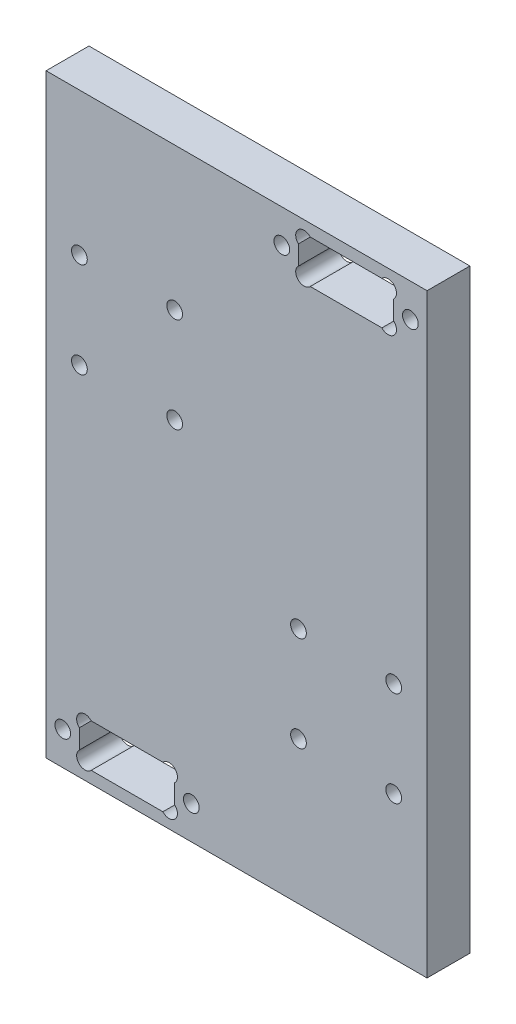
ISO-10303-21;
HEADER;
FILE_DESCRIPTION(('STEP AP214'),'2;1');
FILE_NAME('part.step','',(''),(''),'','','');
FILE_SCHEMA(('AUTOMOTIVE_DESIGN { 1 0 10303 214 1 1 1 1 }'));
ENDSEC;
DATA;
#1=APPLICATION_CONTEXT('core data for automotive mechanical design processes');
#2=APPLICATION_PROTOCOL_DEFINITION('international standard','automotive_design',2000,#1);
#3=PRODUCT_CONTEXT('',#1,'mechanical');
#4=PRODUCT('Part','Part','',(#3));
#5=PRODUCT_RELATED_PRODUCT_CATEGORY('part','',(#4));
#6=PRODUCT_DEFINITION_FORMATION('','',#4);
#7=PRODUCT_DEFINITION_CONTEXT('part definition',#1,'design');
#8=PRODUCT_DEFINITION('design','',#6,#7);
#9=PRODUCT_DEFINITION_SHAPE('','',#8);
#10=(LENGTH_UNIT() NAMED_UNIT(*) SI_UNIT(.MILLI.,.METRE.));
#11=(NAMED_UNIT(*) PLANE_ANGLE_UNIT() SI_UNIT($,.RADIAN.));
#12=(NAMED_UNIT(*) SI_UNIT($,.STERADIAN.) SOLID_ANGLE_UNIT());
#13=UNCERTAINTY_MEASURE_WITH_UNIT(LENGTH_MEASURE(1.E-05),#10,'distance_accuracy_value','');
#14=(GEOMETRIC_REPRESENTATION_CONTEXT(3) GLOBAL_UNCERTAINTY_ASSIGNED_CONTEXT((#13)) GLOBAL_UNIT_ASSIGNED_CONTEXT((#10,
#11,#12)) REPRESENTATION_CONTEXT('',''));
#15=CARTESIAN_POINT('',(0.,0.,0.));
#16=DIRECTION('',(0.,0.,1.));
#17=DIRECTION('',(1.,0.,0.));
#18=AXIS2_PLACEMENT_3D('',#15,#16,#17);
#19=CARTESIAN_POINT('',(0.,0.,9.));
#20=DIRECTION('',(1.,0.,0.));
#21=DIRECTION('',(0.,0.,-1.));
#22=AXIS2_PLACEMENT_3D('',#19,#20,#21);
#23=PLANE('',#22);
#24=DIRECTION('',(0.,-1.,0.));
#25=VECTOR('',#24,1.);
#26=CARTESIAN_POINT('',(0.,0.,0.));
#27=LINE('',#26,#25);
#28=CARTESIAN_POINT('',(0.,125.,0.));
#29=VERTEX_POINT('',#28);
#30=CARTESIAN_POINT('',(0.,0.,0.));
#31=VERTEX_POINT('',#30);
#32=EDGE_CURVE('E153',#29,#31,#27,.T.);
#33=ORIENTED_EDGE('',*,*,#32,.T.);
#34=DIRECTION('',(0.,0.,-1.));
#35=VECTOR('',#34,1.);
#36=CARTESIAN_POINT('',(0.,0.,9.));
#37=LINE('',#36,#35);
#38=CARTESIAN_POINT('',(0.,0.,9.));
#39=VERTEX_POINT('',#38);
#40=EDGE_CURVE('E11',#39,#31,#37,.T.);
#41=ORIENTED_EDGE('',*,*,#40,.F.);
#42=DIRECTION('',(0.,-1.,0.));
#43=VECTOR('',#42,1.);
#44=CARTESIAN_POINT('',(0.,0.,9.));
#45=LINE('',#44,#43);
#46=CARTESIAN_POINT('',(0.,125.,9.));
#47=VERTEX_POINT('',#46);
#48=EDGE_CURVE('E165',#47,#39,#45,.T.);
#49=ORIENTED_EDGE('',*,*,#48,.F.);
#50=DIRECTION('',(0.,0.,-1.));
#51=VECTOR('',#50,1.);
#52=CARTESIAN_POINT('',(0.,125.,9.));
#53=LINE('',#52,#51);
#54=EDGE_CURVE('E178',#47,#29,#53,.T.);
#55=ORIENTED_EDGE('',*,*,#54,.T.);
#56=EDGE_LOOP('',(#33,#41,#49,#55));
#57=FACE_BOUND('',#56,.T.);
#58=ADVANCED_FACE('F33',(#57),#23,.F.);
#59=CARTESIAN_POINT('',(0.,0.,9.));
#60=DIRECTION('',(0.,1.,0.));
#61=DIRECTION('',(0.,0.,1.));
#62=AXIS2_PLACEMENT_3D('',#59,#60,#61);
#63=PLANE('',#62);
#64=DIRECTION('',(1.,0.,0.));
#65=VECTOR('',#64,1.);
#66=CARTESIAN_POINT('',(0.,0.,0.));
#67=LINE('',#66,#65);
#68=CARTESIAN_POINT('',(80.,0.,0.));
#69=VERTEX_POINT('',#68);
#70=EDGE_CURVE('E181',#31,#69,#67,.T.);
#71=ORIENTED_EDGE('',*,*,#70,.T.);
#72=DIRECTION('',(0.,0.,-1.));
#73=VECTOR('',#72,1.);
#74=CARTESIAN_POINT('',(80.,0.,9.));
#75=LINE('',#74,#73);
#76=CARTESIAN_POINT('',(80.,0.,9.));
#77=VERTEX_POINT('',#76);
#78=EDGE_CURVE('E42',#77,#69,#75,.T.);
#79=ORIENTED_EDGE('',*,*,#78,.F.);
#80=DIRECTION('',(1.,0.,0.));
#81=VECTOR('',#80,1.);
#82=CARTESIAN_POINT('',(0.,0.,9.));
#83=LINE('',#82,#81);
#84=EDGE_CURVE('E168',#39,#77,#83,.T.);
#85=ORIENTED_EDGE('',*,*,#84,.F.);
#86=ORIENTED_EDGE('',*,*,#40,.T.);
#87=EDGE_LOOP('',(#71,#79,#85,#86));
#88=FACE_BOUND('',#87,.T.);
#89=ADVANCED_FACE('F413',(#88),#63,.F.);
#90=CARTESIAN_POINT('',(80.,0.,9.));
#91=DIRECTION('',(-1.,0.,0.));
#92=DIRECTION('',(0.,0.,1.));
#93=AXIS2_PLACEMENT_3D('',#90,#91,#92);
#94=PLANE('',#93);
#95=DIRECTION('',(0.,1.,0.));
#96=VECTOR('',#95,1.);
#97=CARTESIAN_POINT('',(80.,0.,0.));
#98=LINE('',#97,#96);
#99=CARTESIAN_POINT('',(80.,125.,0.));
#100=VERTEX_POINT('',#99);
#101=EDGE_CURVE('E184',#69,#100,#98,.T.);
#102=ORIENTED_EDGE('',*,*,#101,.T.);
#103=DIRECTION('',(0.,0.,-1.));
#104=VECTOR('',#103,1.);
#105=CARTESIAN_POINT('',(80.,125.,9.));
#106=LINE('',#105,#104);
#107=CARTESIAN_POINT('',(80.,125.,9.));
#108=VERTEX_POINT('',#107);
#109=EDGE_CURVE('E191',#108,#100,#106,.T.);
#110=ORIENTED_EDGE('',*,*,#109,.F.);
#111=DIRECTION('',(0.,1.,0.));
#112=VECTOR('',#111,1.);
#113=CARTESIAN_POINT('',(80.,0.,9.));
#114=LINE('',#113,#112);
#115=EDGE_CURVE('E172',#77,#108,#114,.T.);
#116=ORIENTED_EDGE('',*,*,#115,.F.);
#117=ORIENTED_EDGE('',*,*,#78,.T.);
#118=EDGE_LOOP('',(#102,#110,#116,#117));
#119=FACE_BOUND('',#118,.T.);
#120=ADVANCED_FACE('F418',(#119),#94,.F.);
#121=CARTESIAN_POINT('',(0.,125.,9.));
#122=DIRECTION('',(0.,-1.,0.));
#123=DIRECTION('',(0.,0.,-1.));
#124=AXIS2_PLACEMENT_3D('',#121,#122,#123);
#125=PLANE('',#124);
#126=DIRECTION('',(-1.,0.,0.));
#127=VECTOR('',#126,1.);
#128=CARTESIAN_POINT('',(0.,125.,0.));
#129=LINE('',#128,#127);
#130=EDGE_CURVE('E169',#100,#29,#129,.T.);
#131=ORIENTED_EDGE('',*,*,#130,.T.);
#132=ORIENTED_EDGE('',*,*,#54,.F.);
#133=DIRECTION('',(-1.,0.,0.));
#134=VECTOR('',#133,1.);
#135=CARTESIAN_POINT('',(0.,125.,9.));
#136=LINE('',#135,#134);
#137=EDGE_CURVE('E175',#108,#47,#136,.T.);
#138=ORIENTED_EDGE('',*,*,#137,.F.);
#139=ORIENTED_EDGE('',*,*,#109,.T.);
#140=EDGE_LOOP('',(#131,#132,#138,#139));
#141=FACE_BOUND('',#140,.T.);
#142=ADVANCED_FACE('F371',(#141),#125,.F.);
#143=CARTESIAN_POINT('',(0.,0.,9.));
#144=DIRECTION('',(0.,0.,-1.));
#145=DIRECTION('',(-1.,0.,0.));
#146=AXIS2_PLACEMENT_3D('',#143,#144,#145);
#147=PLANE('',#146);
#148=CARTESIAN_POINT('',(27.,95.,9.));
#149=DIRECTION('',(0.,0.,1.));
#150=DIRECTION('',(-1.,0.,0.));
#151=AXIS2_PLACEMENT_3D('',#148,#149,#150);
#152=CIRCLE('',#151,1.65);
#153=CARTESIAN_POINT('',(25.35,95.,9.));
#154=VERTEX_POINT('',#153);
#155=EDGE_CURVE('E353',#154,#154,#152,.T.);
#156=ORIENTED_EDGE('',*,*,#155,.F.);
#157=EDGE_LOOP('',(#156));
#158=FACE_BOUND('',#157,.T.);
#159=CARTESIAN_POINT('',(27.,75.,9.));
#160=DIRECTION('',(0.,0.,1.));
#161=DIRECTION('',(1.,0.,0.));
#162=AXIS2_PLACEMENT_3D('',#159,#160,#161);
#163=CIRCLE('',#162,1.65);
#164=CARTESIAN_POINT('',(28.65,75.,9.));
#165=VERTEX_POINT('',#164);
#166=EDGE_CURVE('E347',#165,#165,#163,.T.);
#167=ORIENTED_EDGE('',*,*,#166,.F.);
#168=EDGE_LOOP('',(#167));
#169=FACE_BOUND('',#168,.T.);
#170=CARTESIAN_POINT('',(6.99999999999999,75.,9.));
#171=DIRECTION('',(0.,0.,1.));
#172=DIRECTION('',(-1.,0.,0.));
#173=AXIS2_PLACEMENT_3D('',#170,#171,#172);
#174=CIRCLE('',#173,1.65);
#175=CARTESIAN_POINT('',(5.34999999999999,75.,9.));
#176=VERTEX_POINT('',#175);
#177=EDGE_CURVE('E341',#176,#176,#174,.T.);
#178=ORIENTED_EDGE('',*,*,#177,.F.);
#179=EDGE_LOOP('',(#178));
#180=FACE_BOUND('',#179,.T.);
#181=CARTESIAN_POINT('',(73.,30.,9.));
#182=DIRECTION('',(0.,0.,1.));
#183=DIRECTION('',(1.,0.,0.));
#184=AXIS2_PLACEMENT_3D('',#181,#182,#183);
#185=CIRCLE('',#184,1.65000000000002);
#186=CARTESIAN_POINT('',(74.65,30.,9.));
#187=VERTEX_POINT('',#186);
#188=EDGE_CURVE('E335',#187,#187,#185,.T.);
#189=ORIENTED_EDGE('',*,*,#188,.F.);
#190=EDGE_LOOP('',(#189));
#191=FACE_BOUND('',#190,.T.);
#192=CARTESIAN_POINT('',(53.,30.,9.));
#193=DIRECTION('',(0.,0.,1.));
#194=DIRECTION('',(-1.,0.,0.));
#195=AXIS2_PLACEMENT_3D('',#192,#193,#194);
#196=CIRCLE('',#195,1.65);
#197=CARTESIAN_POINT('',(51.35,30.,9.));
#198=VERTEX_POINT('',#197);
#199=EDGE_CURVE('E329',#198,#198,#196,.T.);
#200=ORIENTED_EDGE('',*,*,#199,.F.);
#201=EDGE_LOOP('',(#200));
#202=FACE_BOUND('',#201,.T.);
#203=CARTESIAN_POINT('',(53.,50.,9.));
#204=DIRECTION('',(0.,0.,1.));
#205=DIRECTION('',(1.,0.,0.));
#206=AXIS2_PLACEMENT_3D('',#203,#204,#205);
#207=CIRCLE('',#206,1.65);
#208=CARTESIAN_POINT('',(54.65,50.,9.));
#209=VERTEX_POINT('',#208);
#210=EDGE_CURVE('E323',#209,#209,#207,.T.);
#211=ORIENTED_EDGE('',*,*,#210,.F.);
#212=EDGE_LOOP('',(#211));
#213=FACE_BOUND('',#212,.T.);
#214=CARTESIAN_POINT('',(73.,50.,9.));
#215=DIRECTION('',(0.,0.,1.));
#216=DIRECTION('',(-1.,0.,0.));
#217=AXIS2_PLACEMENT_3D('',#214,#215,#216);
#218=CIRCLE('',#217,1.65000000000002);
#219=CARTESIAN_POINT('',(71.35,50.,9.));
#220=VERTEX_POINT('',#219);
#221=EDGE_CURVE('E317',#220,#220,#218,.T.);
#222=ORIENTED_EDGE('',*,*,#221,.F.);
#223=EDGE_LOOP('',(#222));
#224=FACE_BOUND('',#223,.T.);
#225=CARTESIAN_POINT('',(7.,95.,9.));
#226=DIRECTION('',(0.,0.,1.));
#227=DIRECTION('',(1.,0.,0.));
#228=AXIS2_PLACEMENT_3D('',#225,#226,#227);
#229=CIRCLE('',#228,1.65);
#230=CARTESIAN_POINT('',(8.65,95.,9.));
#231=VERTEX_POINT('',#230);
#232=EDGE_CURVE('E311',#231,#231,#229,.T.);
#233=ORIENTED_EDGE('',*,*,#232,.F.);
#234=EDGE_LOOP('',(#233));
#235=FACE_BOUND('',#234,.T.);
#236=CARTESIAN_POINT('',(3.5,7.,9.));
#237=DIRECTION('',(0.,0.,-1.));
#238=DIRECTION('',(-1.,0.,0.));
#239=AXIS2_PLACEMENT_3D('',#236,#237,#238);
#240=CIRCLE('',#239,1.65);
#241=CARTESIAN_POINT('',(1.85,7.,9.));
#242=VERTEX_POINT('',#241);
#243=EDGE_CURVE('E246',#242,#242,#240,.T.);
#244=ORIENTED_EDGE('',*,*,#243,.T.);
#245=EDGE_LOOP('',(#244));
#246=FACE_BOUND('',#245,.T.);
#247=CARTESIAN_POINT('',(30.5,7.,9.));
#248=DIRECTION('',(0.,0.,-1.));
#249=DIRECTION('',(-1.,0.,0.));
#250=AXIS2_PLACEMENT_3D('',#247,#248,#249);
#251=CIRCLE('',#250,1.65);
#252=CARTESIAN_POINT('',(28.85,7.,9.));
#253=VERTEX_POINT('',#252);
#254=EDGE_CURVE('E249',#253,#253,#251,.T.);
#255=ORIENTED_EDGE('',*,*,#254,.T.);
#256=EDGE_LOOP('',(#255));
#257=FACE_BOUND('',#256,.T.);
#258=CARTESIAN_POINT('',(49.5,118.,9.));
#259=DIRECTION('',(0.,0.,-1.));
#260=DIRECTION('',(-1.,0.,0.));
#261=AXIS2_PLACEMENT_3D('',#258,#259,#260);
#262=CIRCLE('',#261,1.65);
#263=CARTESIAN_POINT('',(47.85,118.,9.));
#264=VERTEX_POINT('',#263);
#265=EDGE_CURVE('E252',#264,#264,#262,.T.);
#266=ORIENTED_EDGE('',*,*,#265,.T.);
#267=EDGE_LOOP('',(#266));
#268=FACE_BOUND('',#267,.T.);
#269=CARTESIAN_POINT('',(76.5,118.,9.));
#270=DIRECTION('',(0.,0.,-1.));
#271=DIRECTION('',(-1.,0.,0.));
#272=AXIS2_PLACEMENT_3D('',#269,#270,#271);
#273=CIRCLE('',#272,1.64999999999999);
#274=CARTESIAN_POINT('',(74.85,118.,9.));
#275=VERTEX_POINT('',#274);
#276=EDGE_CURVE('E210',#275,#275,#273,.T.);
#277=ORIENTED_EDGE('',*,*,#276,.T.);
#278=EDGE_LOOP('',(#277));
#279=FACE_BOUND('',#278,.T.);
#280=DIRECTION('',(-1.,0.,0.));
#281=VECTOR('',#280,1.);
#282=CARTESIAN_POINT('',(53.,122.5,9.));
#283=LINE('',#282,#281);
#284=CARTESIAN_POINT('',(70.5251262658471,122.5,9.));
#285=VERTEX_POINT('',#284);
#286=CARTESIAN_POINT('',(55.4748737341529,122.5,9.));
#287=VERTEX_POINT('',#286);
#288=EDGE_CURVE('E121',#285,#287,#283,.T.);
#289=ORIENTED_EDGE('',*,*,#288,.F.);
#290=CARTESIAN_POINT('',(71.8313627116336,121.331362711634,9.));
#291=DIRECTION('',(0.,0.,1.));
#292=DIRECTION('',(1.,0.,0.));
#293=AXIS2_PLACEMENT_3D('',#290,#291,#292);
#294=CIRCLE('',#293,1.7527027027027);
#295=CARTESIAN_POINT('',(73.,120.025126265847,9.));
#296=VERTEX_POINT('',#295);
#297=EDGE_CURVE('E36',#296,#285,#294,.T.);
#298=ORIENTED_EDGE('',*,*,#297,.F.);
#299=DIRECTION('',(0.,1.,0.));
#300=VECTOR('',#299,1.);
#301=CARTESIAN_POINT('',(73.,122.5,9.));
#302=LINE('',#301,#300);
#303=CARTESIAN_POINT('',(73.,115.974873734153,9.));
#304=VERTEX_POINT('',#303);
#305=EDGE_CURVE('E131',#304,#296,#302,.T.);
#306=ORIENTED_EDGE('',*,*,#305,.F.);
#307=CARTESIAN_POINT('',(71.8313627116336,114.668637288366,9.));
#308=DIRECTION('',(0.,0.,1.));
#309=DIRECTION('',(1.,0.,0.));
#310=AXIS2_PLACEMENT_3D('',#307,#308,#309);
#311=CIRCLE('',#310,1.75270270270272);
#312=CARTESIAN_POINT('',(70.5251262658471,113.5,9.));
#313=VERTEX_POINT('',#312);
#314=EDGE_CURVE('E115',#313,#304,#311,.T.);
#315=ORIENTED_EDGE('',*,*,#314,.F.);
#316=DIRECTION('',(1.,0.,0.));
#317=VECTOR('',#316,1.);
#318=CARTESIAN_POINT('',(53.,113.5,9.));
#319=LINE('',#318,#317);
#320=CARTESIAN_POINT('',(55.4748737341529,113.5,9.));
#321=VERTEX_POINT('',#320);
#322=EDGE_CURVE('E136',#321,#313,#319,.T.);
#323=ORIENTED_EDGE('',*,*,#322,.F.);
#324=CARTESIAN_POINT('',(54.1686372883664,114.668637288366,9.));
#325=DIRECTION('',(0.,0.,1.));
#326=DIRECTION('',(1.,0.,0.));
#327=AXIS2_PLACEMENT_3D('',#324,#325,#326);
#328=CIRCLE('',#327,1.7527027027027);
#329=CARTESIAN_POINT('',(53.,115.974873734153,9.));
#330=VERTEX_POINT('',#329);
#331=EDGE_CURVE('E201',#330,#321,#328,.T.);
#332=ORIENTED_EDGE('',*,*,#331,.F.);
#333=DIRECTION('',(0.,-1.,0.));
#334=VECTOR('',#333,1.);
#335=CARTESIAN_POINT('',(53.,122.5,9.));
#336=LINE('',#335,#334);
#337=CARTESIAN_POINT('',(53.,120.025126265847,9.));
#338=VERTEX_POINT('',#337);
#339=EDGE_CURVE('E199',#338,#330,#336,.T.);
#340=ORIENTED_EDGE('',*,*,#339,.F.);
#341=CARTESIAN_POINT('',(54.1686372883664,121.331362711634,9.));
#342=DIRECTION('',(0.,0.,1.));
#343=DIRECTION('',(1.,0.,0.));
#344=AXIS2_PLACEMENT_3D('',#341,#342,#343);
#345=CIRCLE('',#344,1.7527027027027);
#346=EDGE_CURVE('E114',#287,#338,#345,.T.);
#347=ORIENTED_EDGE('',*,*,#346,.F.);
#348=EDGE_LOOP('',(#289,#298,#306,#315,#323,#332,#340,#347));
#349=FACE_BOUND('',#348,.T.);
#350=DIRECTION('',(-1.,0.,0.));
#351=VECTOR('',#350,1.);
#352=CARTESIAN_POINT('',(7.,11.5,9.));
#353=LINE('',#352,#351);
#354=CARTESIAN_POINT('',(24.5251262658471,11.5,9.));
#355=VERTEX_POINT('',#354);
#356=CARTESIAN_POINT('',(9.47487373415292,11.5,9.));
#357=VERTEX_POINT('',#356);
#358=EDGE_CURVE('E144',#355,#357,#353,.T.);
#359=ORIENTED_EDGE('',*,*,#358,.F.);
#360=CARTESIAN_POINT('',(25.8313627116336,10.3313627116336,9.));
#361=DIRECTION('',(0.,0.,1.));
#362=DIRECTION('',(1.,0.,0.));
#363=AXIS2_PLACEMENT_3D('',#360,#361,#362);
#364=CIRCLE('',#363,1.7527027027027);
#365=CARTESIAN_POINT('',(27.,9.02512626584708,9.));
#366=VERTEX_POINT('',#365);
#367=EDGE_CURVE('E209',#366,#355,#364,.T.);
#368=ORIENTED_EDGE('',*,*,#367,.F.);
#369=DIRECTION('',(0.,1.,0.));
#370=VECTOR('',#369,1.);
#371=CARTESIAN_POINT('',(27.,11.5,9.));
#372=LINE('',#371,#370);
#373=CARTESIAN_POINT('',(27.,4.97487373415292,9.));
#374=VERTEX_POINT('',#373);
#375=EDGE_CURVE('E160',#374,#366,#372,.T.);
#376=ORIENTED_EDGE('',*,*,#375,.F.);
#377=CARTESIAN_POINT('',(25.8313627116336,3.66863728836641,9.));
#378=DIRECTION('',(0.,0.,1.));
#379=DIRECTION('',(1.,0.,0.));
#380=AXIS2_PLACEMENT_3D('',#377,#378,#379);
#381=CIRCLE('',#380,1.7527027027027);
#382=CARTESIAN_POINT('',(24.5251262658471,2.5,9.));
#383=VERTEX_POINT('',#382);
#384=EDGE_CURVE('E207',#383,#374,#381,.T.);
#385=ORIENTED_EDGE('',*,*,#384,.F.);
#386=DIRECTION('',(1.,0.,0.));
#387=VECTOR('',#386,1.);
#388=CARTESIAN_POINT('',(7.,2.5,9.));
#389=LINE('',#388,#387);
#390=CARTESIAN_POINT('',(9.47487373415292,2.5,9.));
#391=VERTEX_POINT('',#390);
#392=EDGE_CURVE('E157',#391,#383,#389,.T.);
#393=ORIENTED_EDGE('',*,*,#392,.F.);
#394=CARTESIAN_POINT('',(8.16863728836642,3.66863728836642,9.));
#395=DIRECTION('',(0.,0.,1.));
#396=DIRECTION('',(1.,0.,0.));
#397=AXIS2_PLACEMENT_3D('',#394,#395,#396);
#398=CIRCLE('',#397,1.7527027027027);
#399=CARTESIAN_POINT('',(7.,4.97487373415292,9.));
#400=VERTEX_POINT('',#399);
#401=EDGE_CURVE('E205',#400,#391,#398,.T.);
#402=ORIENTED_EDGE('',*,*,#401,.F.);
#403=DIRECTION('',(0.,-1.,0.));
#404=VECTOR('',#403,1.);
#405=CARTESIAN_POINT('',(7.,11.5,9.));
#406=LINE('',#405,#404);
#407=CARTESIAN_POINT('',(7.,9.02512626584708,9.));
#408=VERTEX_POINT('',#407);
#409=EDGE_CURVE('E154',#408,#400,#406,.T.);
#410=ORIENTED_EDGE('',*,*,#409,.F.);
#411=CARTESIAN_POINT('',(8.16863728836642,10.3313627116336,9.));
#412=DIRECTION('',(0.,0.,1.));
#413=DIRECTION('',(1.,0.,0.));
#414=AXIS2_PLACEMENT_3D('',#411,#412,#413);
#415=CIRCLE('',#414,1.7527027027027);
#416=EDGE_CURVE('E196',#357,#408,#415,.T.);
#417=ORIENTED_EDGE('',*,*,#416,.F.);
#418=EDGE_LOOP('',(#359,#368,#376,#385,#393,#402,#410,#417));
#419=FACE_BOUND('',#418,.T.);
#420=ORIENTED_EDGE('',*,*,#48,.T.);
#421=ORIENTED_EDGE('',*,*,#84,.T.);
#422=ORIENTED_EDGE('',*,*,#115,.T.);
#423=ORIENTED_EDGE('',*,*,#137,.T.);
#424=EDGE_LOOP('',(#420,#421,#422,#423));
#425=FACE_BOUND('',#424,.T.);
#426=ADVANCED_FACE('F127',(#158,#169,#180,#191,#202,#213,#224,#235,#246,#257,#268,#279,#349,
#419,#425),#147,.F.);
#427=CARTESIAN_POINT('',(0.,0.,0.));
#428=DIRECTION('',(0.,0.,-1.));
#429=DIRECTION('',(-1.,0.,0.));
#430=AXIS2_PLACEMENT_3D('',#427,#428,#429);
#431=PLANE('',#430);
#432=CARTESIAN_POINT('',(27.,95.,0.));
#433=DIRECTION('',(0.,0.,1.));
#434=DIRECTION('',(-1.,0.,0.));
#435=AXIS2_PLACEMENT_3D('',#432,#433,#434);
#436=CIRCLE('',#435,1.65);
#437=CARTESIAN_POINT('',(25.35,95.,0.));
#438=VERTEX_POINT('',#437);
#439=EDGE_CURVE('E314',#438,#438,#436,.T.);
#440=ORIENTED_EDGE('',*,*,#439,.T.);
#441=EDGE_LOOP('',(#440));
#442=FACE_BOUND('',#441,.T.);
#443=CARTESIAN_POINT('',(27.,75.,0.));
#444=DIRECTION('',(0.,0.,1.));
#445=DIRECTION('',(1.,0.,0.));
#446=AXIS2_PLACEMENT_3D('',#443,#444,#445);
#447=CIRCLE('',#446,1.65);
#448=CARTESIAN_POINT('',(28.65,75.,0.));
#449=VERTEX_POINT('',#448);
#450=EDGE_CURVE('E350',#449,#449,#447,.T.);
#451=ORIENTED_EDGE('',*,*,#450,.T.);
#452=EDGE_LOOP('',(#451));
#453=FACE_BOUND('',#452,.T.);
#454=CARTESIAN_POINT('',(6.99999999999999,75.,0.));
#455=DIRECTION('',(0.,0.,1.));
#456=DIRECTION('',(-1.,0.,0.));
#457=AXIS2_PLACEMENT_3D('',#454,#455,#456);
#458=CIRCLE('',#457,1.65);
#459=CARTESIAN_POINT('',(5.34999999999999,75.,0.));
#460=VERTEX_POINT('',#459);
#461=EDGE_CURVE('E344',#460,#460,#458,.T.);
#462=ORIENTED_EDGE('',*,*,#461,.T.);
#463=EDGE_LOOP('',(#462));
#464=FACE_BOUND('',#463,.T.);
#465=CARTESIAN_POINT('',(73.,30.,0.));
#466=DIRECTION('',(0.,0.,1.));
#467=DIRECTION('',(1.,0.,0.));
#468=AXIS2_PLACEMENT_3D('',#465,#466,#467);
#469=CIRCLE('',#468,1.65000000000002);
#470=CARTESIAN_POINT('',(74.65,30.,0.));
#471=VERTEX_POINT('',#470);
#472=EDGE_CURVE('E338',#471,#471,#469,.T.);
#473=ORIENTED_EDGE('',*,*,#472,.T.);
#474=EDGE_LOOP('',(#473));
#475=FACE_BOUND('',#474,.T.);
#476=CARTESIAN_POINT('',(53.,30.,0.));
#477=DIRECTION('',(0.,0.,1.));
#478=DIRECTION('',(-1.,0.,0.));
#479=AXIS2_PLACEMENT_3D('',#476,#477,#478);
#480=CIRCLE('',#479,1.65);
#481=CARTESIAN_POINT('',(51.35,30.,0.));
#482=VERTEX_POINT('',#481);
#483=EDGE_CURVE('E332',#482,#482,#480,.T.);
#484=ORIENTED_EDGE('',*,*,#483,.T.);
#485=EDGE_LOOP('',(#484));
#486=FACE_BOUND('',#485,.T.);
#487=CARTESIAN_POINT('',(53.,50.,0.));
#488=DIRECTION('',(0.,0.,1.));
#489=DIRECTION('',(1.,0.,0.));
#490=AXIS2_PLACEMENT_3D('',#487,#488,#489);
#491=CIRCLE('',#490,1.65);
#492=CARTESIAN_POINT('',(54.65,50.,0.));
#493=VERTEX_POINT('',#492);
#494=EDGE_CURVE('E326',#493,#493,#491,.T.);
#495=ORIENTED_EDGE('',*,*,#494,.T.);
#496=EDGE_LOOP('',(#495));
#497=FACE_BOUND('',#496,.T.);
#498=CARTESIAN_POINT('',(73.,50.,0.));
#499=DIRECTION('',(0.,0.,1.));
#500=DIRECTION('',(-1.,0.,0.));
#501=AXIS2_PLACEMENT_3D('',#498,#499,#500);
#502=CIRCLE('',#501,1.65000000000002);
#503=CARTESIAN_POINT('',(71.35,50.,0.));
#504=VERTEX_POINT('',#503);
#505=EDGE_CURVE('E320',#504,#504,#502,.T.);
#506=ORIENTED_EDGE('',*,*,#505,.T.);
#507=EDGE_LOOP('',(#506));
#508=FACE_BOUND('',#507,.T.);
#509=CARTESIAN_POINT('',(7.,95.,0.));
#510=DIRECTION('',(0.,0.,1.));
#511=DIRECTION('',(1.,0.,0.));
#512=AXIS2_PLACEMENT_3D('',#509,#510,#511);
#513=CIRCLE('',#512,1.65);
#514=CARTESIAN_POINT('',(8.65,95.,0.));
#515=VERTEX_POINT('',#514);
#516=EDGE_CURVE('E306',#515,#515,#513,.T.);
#517=ORIENTED_EDGE('',*,*,#516,.T.);
#518=EDGE_LOOP('',(#517));
#519=FACE_BOUND('',#518,.T.);
#520=CARTESIAN_POINT('',(3.5,7.,0.));
#521=DIRECTION('',(0.,0.,1.));
#522=DIRECTION('',(1.,0.,0.));
#523=AXIS2_PLACEMENT_3D('',#520,#521,#522);
#524=CIRCLE('',#523,1.65);
#525=CARTESIAN_POINT('',(5.15,7.,0.));
#526=VERTEX_POINT('',#525);
#527=EDGE_CURVE('E296',#526,#526,#524,.T.);
#528=ORIENTED_EDGE('',*,*,#527,.T.);
#529=EDGE_LOOP('',(#528));
#530=FACE_BOUND('',#529,.T.);
#531=CARTESIAN_POINT('',(71.8313627116336,121.331362711634,0.));
#532=DIRECTION('',(0.,0.,1.));
#533=DIRECTION('',(1.,0.,0.));
#534=AXIS2_PLACEMENT_3D('',#531,#532,#533);
#535=CIRCLE('',#534,1.7527027027027);
#536=CARTESIAN_POINT('',(73.,120.025126265847,0.));
#537=VERTEX_POINT('',#536);
#538=CARTESIAN_POINT('',(70.5251262658471,122.5,0.));
#539=VERTEX_POINT('',#538);
#540=EDGE_CURVE('E124',#537,#539,#535,.T.);
#541=ORIENTED_EDGE('',*,*,#540,.T.);
#542=DIRECTION('',(-1.,0.,0.));
#543=VECTOR('',#542,1.);
#544=CARTESIAN_POINT('',(53.,122.5,0.));
#545=LINE('',#544,#543);
#546=CARTESIAN_POINT('',(55.4748737341529,122.5,0.));
#547=VERTEX_POINT('',#546);
#548=EDGE_CURVE('E123',#539,#547,#545,.T.);
#549=ORIENTED_EDGE('',*,*,#548,.T.);
#550=CARTESIAN_POINT('',(54.1686372883664,121.331362711634,0.));
#551=DIRECTION('',(0.,0.,1.));
#552=DIRECTION('',(-1.,0.,0.));
#553=AXIS2_PLACEMENT_3D('',#550,#551,#552);
#554=CIRCLE('',#553,1.7527027027027);
#555=CARTESIAN_POINT('',(53.,120.025126265847,0.));
#556=VERTEX_POINT('',#555);
#557=EDGE_CURVE('E225',#547,#556,#554,.T.);
#558=ORIENTED_EDGE('',*,*,#557,.T.);
#559=DIRECTION('',(0.,-1.,0.));
#560=VECTOR('',#559,1.);
#561=CARTESIAN_POINT('',(53.,122.5,0.));
#562=LINE('',#561,#560);
#563=CARTESIAN_POINT('',(53.,115.974873734153,0.));
#564=VERTEX_POINT('',#563);
#565=EDGE_CURVE('E130',#556,#564,#562,.T.);
#566=ORIENTED_EDGE('',*,*,#565,.T.);
#567=CARTESIAN_POINT('',(54.1686372883664,114.668637288366,0.));
#568=DIRECTION('',(0.,0.,1.));
#569=DIRECTION('',(1.,0.,0.));
#570=AXIS2_PLACEMENT_3D('',#567,#568,#569);
#571=CIRCLE('',#570,1.7527027027027);
#572=CARTESIAN_POINT('',(55.4748737341529,113.5,0.));
#573=VERTEX_POINT('',#572);
#574=EDGE_CURVE('E277',#564,#573,#571,.T.);
#575=ORIENTED_EDGE('',*,*,#574,.T.);
#576=DIRECTION('',(1.,0.,0.));
#577=VECTOR('',#576,1.);
#578=CARTESIAN_POINT('',(53.,113.5,0.));
#579=LINE('',#578,#577);
#580=CARTESIAN_POINT('',(70.5251262658471,113.5,0.));
#581=VERTEX_POINT('',#580);
#582=EDGE_CURVE('E134',#573,#581,#579,.T.);
#583=ORIENTED_EDGE('',*,*,#582,.T.);
#584=CARTESIAN_POINT('',(71.8313627116336,114.668637288366,0.));
#585=DIRECTION('',(0.,0.,1.));
#586=DIRECTION('',(-1.,0.,0.));
#587=AXIS2_PLACEMENT_3D('',#584,#585,#586);
#588=CIRCLE('',#587,1.75270270270272);
#589=CARTESIAN_POINT('',(73.,115.974873734153,0.));
#590=VERTEX_POINT('',#589);
#591=EDGE_CURVE('E273',#581,#590,#588,.T.);
#592=ORIENTED_EDGE('',*,*,#591,.T.);
#593=DIRECTION('',(0.,1.,0.));
#594=VECTOR('',#593,1.);
#595=CARTESIAN_POINT('',(73.,122.5,0.));
#596=LINE('',#595,#594);
#597=EDGE_CURVE('E233',#590,#537,#596,.T.);
#598=ORIENTED_EDGE('',*,*,#597,.T.);
#599=EDGE_LOOP('',(#541,#549,#558,#566,#575,#583,#592,#598));
#600=FACE_BOUND('',#599,.T.);
#601=CARTESIAN_POINT('',(30.5,7.,0.));
#602=DIRECTION('',(0.,0.,1.));
#603=DIRECTION('',(-1.,0.,0.));
#604=AXIS2_PLACEMENT_3D('',#601,#602,#603);
#605=CIRCLE('',#604,1.65);
#606=CARTESIAN_POINT('',(28.85,7.,0.));
#607=VERTEX_POINT('',#606);
#608=EDGE_CURVE('E299',#607,#607,#605,.T.);
#609=ORIENTED_EDGE('',*,*,#608,.T.);
#610=EDGE_LOOP('',(#609));
#611=FACE_BOUND('',#610,.T.);
#612=CARTESIAN_POINT('',(49.5,118.,0.));
#613=DIRECTION('',(0.,0.,1.));
#614=DIRECTION('',(-1.,0.,0.));
#615=AXIS2_PLACEMENT_3D('',#612,#613,#614);
#616=CIRCLE('',#615,1.65);
#617=CARTESIAN_POINT('',(47.85,118.,0.));
#618=VERTEX_POINT('',#617);
#619=EDGE_CURVE('E305',#618,#618,#616,.T.);
#620=ORIENTED_EDGE('',*,*,#619,.T.);
#621=EDGE_LOOP('',(#620));
#622=FACE_BOUND('',#621,.T.);
#623=CARTESIAN_POINT('',(76.5,118.,0.));
#624=DIRECTION('',(0.,0.,1.));
#625=DIRECTION('',(1.,0.,0.));
#626=AXIS2_PLACEMENT_3D('',#623,#624,#625);
#627=CIRCLE('',#626,1.64999999999999);
#628=CARTESIAN_POINT('',(78.15,118.,0.));
#629=VERTEX_POINT('',#628);
#630=EDGE_CURVE('E302',#629,#629,#627,.T.);
#631=ORIENTED_EDGE('',*,*,#630,.T.);
#632=EDGE_LOOP('',(#631));
#633=FACE_BOUND('',#632,.T.);
#634=CARTESIAN_POINT('',(25.8313627116336,10.3313627116336,0.));
#635=DIRECTION('',(0.,0.,1.));
#636=DIRECTION('',(1.,0.,0.));
#637=AXIS2_PLACEMENT_3D('',#634,#635,#636);
#638=CIRCLE('',#637,1.7527027027027);
#639=CARTESIAN_POINT('',(27.,9.02512626584708,0.));
#640=VERTEX_POINT('',#639);
#641=CARTESIAN_POINT('',(24.5251262658471,11.5,0.));
#642=VERTEX_POINT('',#641);
#643=EDGE_CURVE('E51',#640,#642,#638,.T.);
#644=ORIENTED_EDGE('',*,*,#643,.T.);
#645=DIRECTION('',(-1.,0.,0.));
#646=VECTOR('',#645,1.);
#647=CARTESIAN_POINT('',(7.,11.5,0.));
#648=LINE('',#647,#646);
#649=CARTESIAN_POINT('',(9.47487373415292,11.5,0.));
#650=VERTEX_POINT('',#649);
#651=EDGE_CURVE('E150',#642,#650,#648,.T.);
#652=ORIENTED_EDGE('',*,*,#651,.T.);
#653=CARTESIAN_POINT('',(8.16863728836642,10.3313627116336,0.));
#654=DIRECTION('',(0.,0.,1.));
#655=DIRECTION('',(-1.,0.,0.));
#656=AXIS2_PLACEMENT_3D('',#653,#654,#655);
#657=CIRCLE('',#656,1.7527027027027);
#658=CARTESIAN_POINT('',(7.,9.02512626584708,0.));
#659=VERTEX_POINT('',#658);
#660=EDGE_CURVE('E243',#650,#659,#657,.T.);
#661=ORIENTED_EDGE('',*,*,#660,.T.);
#662=DIRECTION('',(0.,-1.,0.));
#663=VECTOR('',#662,1.);
#664=CARTESIAN_POINT('',(7.,11.5,0.));
#665=LINE('',#664,#663);
#666=CARTESIAN_POINT('',(7.,4.97487373415292,0.));
#667=VERTEX_POINT('',#666);
#668=EDGE_CURVE('E140',#659,#667,#665,.T.);
#669=ORIENTED_EDGE('',*,*,#668,.T.);
#670=CARTESIAN_POINT('',(8.16863728836642,3.66863728836642,0.));
#671=DIRECTION('',(0.,0.,1.));
#672=DIRECTION('',(1.,0.,0.));
#673=AXIS2_PLACEMENT_3D('',#670,#671,#672);
#674=CIRCLE('',#673,1.7527027027027);
#675=CARTESIAN_POINT('',(9.47487373415292,2.5,0.));
#676=VERTEX_POINT('',#675);
#677=EDGE_CURVE('E282',#667,#676,#674,.T.);
#678=ORIENTED_EDGE('',*,*,#677,.T.);
#679=DIRECTION('',(1.,0.,0.));
#680=VECTOR('',#679,1.);
#681=CARTESIAN_POINT('',(7.,2.5,0.));
#682=LINE('',#681,#680);
#683=CARTESIAN_POINT('',(24.5251262658471,2.5,0.));
#684=VERTEX_POINT('',#683);
#685=EDGE_CURVE('E143',#676,#684,#682,.T.);
#686=ORIENTED_EDGE('',*,*,#685,.T.);
#687=CARTESIAN_POINT('',(25.8313627116336,3.66863728836641,0.));
#688=DIRECTION('',(0.,0.,1.));
#689=DIRECTION('',(-1.,0.,0.));
#690=AXIS2_PLACEMENT_3D('',#687,#688,#689);
#691=CIRCLE('',#690,1.7527027027027);
#692=CARTESIAN_POINT('',(27.,4.97487373415292,0.));
#693=VERTEX_POINT('',#692);
#694=EDGE_CURVE('E262',#684,#693,#691,.T.);
#695=ORIENTED_EDGE('',*,*,#694,.T.);
#696=DIRECTION('',(0.,1.,0.));
#697=VECTOR('',#696,1.);
#698=CARTESIAN_POINT('',(27.,11.5,0.));
#699=LINE('',#698,#697);
#700=EDGE_CURVE('E147',#693,#640,#699,.T.);
#701=ORIENTED_EDGE('',*,*,#700,.T.);
#702=EDGE_LOOP('',(#644,#652,#661,#669,#678,#686,#695,#701));
#703=FACE_BOUND('',#702,.T.);
#704=ORIENTED_EDGE('',*,*,#32,.F.);
#705=ORIENTED_EDGE('',*,*,#130,.F.);
#706=ORIENTED_EDGE('',*,*,#101,.F.);
#707=ORIENTED_EDGE('',*,*,#70,.F.);
#708=EDGE_LOOP('',(#704,#705,#706,#707));
#709=FACE_BOUND('',#708,.T.);
#710=ADVANCED_FACE('F359',(#442,#453,#464,#475,#486,#497,#508,#519,#530,#600,#611,#622,#633,
#703,#709),#431,.T.);
#711=CARTESIAN_POINT('',(7.,11.5,0.));
#712=DIRECTION('',(-1.,0.,0.));
#713=DIRECTION('',(0.,-1.,0.));
#714=AXIS2_PLACEMENT_3D('',#711,#712,#713);
#715=PLANE('',#714);
#716=ORIENTED_EDGE('',*,*,#409,.T.);
#717=DIRECTION('',(0.,0.,1.));
#718=VECTOR('',#717,1.);
#719=CARTESIAN_POINT('',(7.,4.97487373415292,0.));
#720=LINE('',#719,#718);
#721=EDGE_CURVE('E265',#667,#400,#720,.T.);
#722=ORIENTED_EDGE('',*,*,#721,.F.);
#723=ORIENTED_EDGE('',*,*,#668,.F.);
#724=DIRECTION('',(0.,0.,1.));
#725=VECTOR('',#724,1.);
#726=CARTESIAN_POINT('',(7.,9.02512626584708,0.));
#727=LINE('',#726,#725);
#728=EDGE_CURVE('E240',#659,#408,#727,.T.);
#729=ORIENTED_EDGE('',*,*,#728,.T.);
#730=EDGE_LOOP('',(#716,#722,#723,#729));
#731=FACE_BOUND('',#730,.T.);
#732=ADVANCED_FACE('F501',(#731),#715,.F.);
#733=CARTESIAN_POINT('',(7.,11.5,0.));
#734=DIRECTION('',(0.,1.,0.));
#735=DIRECTION('',(0.,0.,1.));
#736=AXIS2_PLACEMENT_3D('',#733,#734,#735);
#737=PLANE('',#736);
#738=ORIENTED_EDGE('',*,*,#651,.F.);
#739=DIRECTION('',(0.,0.,1.));
#740=VECTOR('',#739,1.);
#741=CARTESIAN_POINT('',(24.5251262658471,11.5,0.));
#742=LINE('',#741,#740);
#743=EDGE_CURVE('E267',#642,#355,#742,.T.);
#744=ORIENTED_EDGE('',*,*,#743,.T.);
#745=ORIENTED_EDGE('',*,*,#358,.T.);
#746=DIRECTION('',(0.,0.,1.));
#747=VECTOR('',#746,1.);
#748=CARTESIAN_POINT('',(9.47487373415292,11.5,0.));
#749=LINE('',#748,#747);
#750=EDGE_CURVE('E200',#650,#357,#749,.T.);
#751=ORIENTED_EDGE('',*,*,#750,.F.);
#752=EDGE_LOOP('',(#738,#744,#745,#751));
#753=FACE_BOUND('',#752,.T.);
#754=ADVANCED_FACE('F505',(#753),#737,.F.);
#755=CARTESIAN_POINT('',(27.,11.5,0.));
#756=DIRECTION('',(1.,0.,0.));
#757=DIRECTION('',(0.,0.,-1.));
#758=AXIS2_PLACEMENT_3D('',#755,#756,#757);
#759=PLANE('',#758);
#760=ORIENTED_EDGE('',*,*,#375,.T.);
#761=DIRECTION('',(0.,0.,1.));
#762=VECTOR('',#761,1.);
#763=CARTESIAN_POINT('',(27.,9.02512626584708,0.));
#764=LINE('',#763,#762);
#765=EDGE_CURVE('E203',#640,#366,#764,.T.);
#766=ORIENTED_EDGE('',*,*,#765,.F.);
#767=ORIENTED_EDGE('',*,*,#700,.F.);
#768=DIRECTION('',(0.,0.,1.));
#769=VECTOR('',#768,1.);
#770=CARTESIAN_POINT('',(27.,4.97487373415292,0.));
#771=LINE('',#770,#769);
#772=EDGE_CURVE('E259',#693,#374,#771,.T.);
#773=ORIENTED_EDGE('',*,*,#772,.T.);
#774=EDGE_LOOP('',(#760,#766,#767,#773));
#775=FACE_BOUND('',#774,.T.);
#776=ADVANCED_FACE('F510',(#775),#759,.F.);
#777=CARTESIAN_POINT('',(7.,2.5,0.));
#778=DIRECTION('',(0.,-1.,0.));
#779=DIRECTION('',(0.,0.,-1.));
#780=AXIS2_PLACEMENT_3D('',#777,#778,#779);
#781=PLANE('',#780);
#782=ORIENTED_EDGE('',*,*,#392,.T.);
#783=DIRECTION('',(0.,0.,1.));
#784=VECTOR('',#783,1.);
#785=CARTESIAN_POINT('',(24.5251262658471,2.5,0.));
#786=LINE('',#785,#784);
#787=EDGE_CURVE('E257',#684,#383,#786,.T.);
#788=ORIENTED_EDGE('',*,*,#787,.F.);
#789=ORIENTED_EDGE('',*,*,#685,.F.);
#790=DIRECTION('',(0.,0.,1.));
#791=VECTOR('',#790,1.);
#792=CARTESIAN_POINT('',(9.47487373415292,2.5,0.));
#793=LINE('',#792,#791);
#794=EDGE_CURVE('E289',#676,#391,#793,.T.);
#795=ORIENTED_EDGE('',*,*,#794,.T.);
#796=EDGE_LOOP('',(#782,#788,#789,#795));
#797=FACE_BOUND('',#796,.T.);
#798=ADVANCED_FACE('F507',(#797),#781,.F.);
#799=CARTESIAN_POINT('',(53.,122.5,0.));
#800=DIRECTION('',(-1.,0.,0.));
#801=DIRECTION('',(0.,0.,1.));
#802=AXIS2_PLACEMENT_3D('',#799,#800,#801);
#803=PLANE('',#802);
#804=ORIENTED_EDGE('',*,*,#565,.F.);
#805=DIRECTION('',(0.,0.,1.));
#806=VECTOR('',#805,1.);
#807=CARTESIAN_POINT('',(53.,120.025126265847,0.));
#808=LINE('',#807,#806);
#809=EDGE_CURVE('E217',#556,#338,#808,.T.);
#810=ORIENTED_EDGE('',*,*,#809,.T.);
#811=ORIENTED_EDGE('',*,*,#339,.T.);
#812=DIRECTION('',(0.,0.,1.));
#813=VECTOR('',#812,1.);
#814=CARTESIAN_POINT('',(53.,115.974873734153,0.));
#815=LINE('',#814,#813);
#816=EDGE_CURVE('E271',#564,#330,#815,.T.);
#817=ORIENTED_EDGE('',*,*,#816,.F.);
#818=EDGE_LOOP('',(#804,#810,#811,#817));
#819=FACE_BOUND('',#818,.T.);
#820=ADVANCED_FACE('F223',(#819),#803,.F.);
#821=CARTESIAN_POINT('',(53.,122.5,0.));
#822=DIRECTION('',(0.,1.,0.));
#823=DIRECTION('',(-1.,0.,0.));
#824=AXIS2_PLACEMENT_3D('',#821,#822,#823);
#825=PLANE('',#824);
#826=ORIENTED_EDGE('',*,*,#548,.F.);
#827=DIRECTION('',(0.,0.,1.));
#828=VECTOR('',#827,1.);
#829=CARTESIAN_POINT('',(70.5251262658471,122.5,0.));
#830=LINE('',#829,#828);
#831=EDGE_CURVE('E108',#539,#285,#830,.T.);
#832=ORIENTED_EDGE('',*,*,#831,.T.);
#833=ORIENTED_EDGE('',*,*,#288,.T.);
#834=DIRECTION('',(0.,0.,1.));
#835=VECTOR('',#834,1.);
#836=CARTESIAN_POINT('',(55.4748737341529,122.5,0.));
#837=LINE('',#836,#835);
#838=EDGE_CURVE('E219',#547,#287,#837,.T.);
#839=ORIENTED_EDGE('',*,*,#838,.F.);
#840=EDGE_LOOP('',(#826,#832,#833,#839));
#841=FACE_BOUND('',#840,.T.);
#842=ADVANCED_FACE('F119',(#841),#825,.F.);
#843=CARTESIAN_POINT('',(73.,122.5,0.));
#844=DIRECTION('',(1.,0.,0.));
#845=DIRECTION('',(0.,1.,0.));
#846=AXIS2_PLACEMENT_3D('',#843,#844,#845);
#847=PLANE('',#846);
#848=ORIENTED_EDGE('',*,*,#305,.T.);
#849=DIRECTION('',(0.,0.,1.));
#850=VECTOR('',#849,1.);
#851=CARTESIAN_POINT('',(73.,120.025126265847,0.));
#852=LINE('',#851,#850);
#853=EDGE_CURVE('E102',#537,#296,#852,.T.);
#854=ORIENTED_EDGE('',*,*,#853,.F.);
#855=ORIENTED_EDGE('',*,*,#597,.F.);
#856=DIRECTION('',(0.,0.,1.));
#857=VECTOR('',#856,1.);
#858=CARTESIAN_POINT('',(73.,115.974873734153,0.));
#859=LINE('',#858,#857);
#860=EDGE_CURVE('E283',#590,#304,#859,.T.);
#861=ORIENTED_EDGE('',*,*,#860,.T.);
#862=EDGE_LOOP('',(#848,#854,#855,#861));
#863=FACE_BOUND('',#862,.T.);
#864=ADVANCED_FACE('F456',(#863),#847,.F.);
#865=CARTESIAN_POINT('',(53.,113.5,0.));
#866=DIRECTION('',(0.,-1.,0.));
#867=DIRECTION('',(1.,0.,0.));
#868=AXIS2_PLACEMENT_3D('',#865,#866,#867);
#869=PLANE('',#868);
#870=ORIENTED_EDGE('',*,*,#322,.T.);
#871=DIRECTION('',(0.,0.,1.));
#872=VECTOR('',#871,1.);
#873=CARTESIAN_POINT('',(70.5251262658471,113.5,0.));
#874=LINE('',#873,#872);
#875=EDGE_CURVE('E280',#581,#313,#874,.T.);
#876=ORIENTED_EDGE('',*,*,#875,.F.);
#877=ORIENTED_EDGE('',*,*,#582,.F.);
#878=DIRECTION('',(0.,0.,1.));
#879=VECTOR('',#878,1.);
#880=CARTESIAN_POINT('',(55.4748737341529,113.5,0.));
#881=LINE('',#880,#879);
#882=EDGE_CURVE('E274',#573,#321,#881,.T.);
#883=ORIENTED_EDGE('',*,*,#882,.T.);
#884=EDGE_LOOP('',(#870,#876,#877,#883));
#885=FACE_BOUND('',#884,.T.);
#886=ADVANCED_FACE('F463',(#885),#869,.F.);
#887=CARTESIAN_POINT('',(8.16863728836642,10.3313627116336,0.));
#888=DIRECTION('',(0.,0.,1.));
#889=DIRECTION('',(1.,0.,0.));
#890=AXIS2_PLACEMENT_3D('',#887,#888,#889);
#891=CYLINDRICAL_SURFACE('',#890,1.7527027027027);
#892=ORIENTED_EDGE('',*,*,#728,.F.);
#893=ORIENTED_EDGE('',*,*,#660,.F.);
#894=ORIENTED_EDGE('',*,*,#750,.T.);
#895=ORIENTED_EDGE('',*,*,#416,.T.);
#896=EDGE_LOOP('',(#892,#893,#894,#895));
#897=FACE_BOUND('',#896,.T.);
#898=ADVANCED_FACE('F522',(#897),#891,.F.);
#899=CARTESIAN_POINT('',(54.1686372883664,114.668637288366,0.));
#900=DIRECTION('',(0.,0.,1.));
#901=DIRECTION('',(1.,0.,0.));
#902=AXIS2_PLACEMENT_3D('',#899,#900,#901);
#903=CYLINDRICAL_SURFACE('',#902,1.7527027027027);
#904=ORIENTED_EDGE('',*,*,#882,.F.);
#905=ORIENTED_EDGE('',*,*,#574,.F.);
#906=ORIENTED_EDGE('',*,*,#816,.T.);
#907=ORIENTED_EDGE('',*,*,#331,.T.);
#908=EDGE_LOOP('',(#904,#905,#906,#907));
#909=FACE_BOUND('',#908,.T.);
#910=ADVANCED_FACE('F469',(#909),#903,.F.);
#911=CARTESIAN_POINT('',(71.8313627116336,114.668637288366,0.));
#912=DIRECTION('',(0.,0.,1.));
#913=DIRECTION('',(1.,0.,0.));
#914=AXIS2_PLACEMENT_3D('',#911,#912,#913);
#915=CYLINDRICAL_SURFACE('',#914,1.75270270270272);
#916=ORIENTED_EDGE('',*,*,#860,.F.);
#917=ORIENTED_EDGE('',*,*,#591,.F.);
#918=ORIENTED_EDGE('',*,*,#875,.T.);
#919=ORIENTED_EDGE('',*,*,#314,.T.);
#920=EDGE_LOOP('',(#916,#917,#918,#919));
#921=FACE_BOUND('',#920,.T.);
#922=ADVANCED_FACE('F536',(#921),#915,.F.);
#923=CARTESIAN_POINT('',(71.8313627116336,121.331362711634,0.));
#924=DIRECTION('',(0.,0.,1.));
#925=DIRECTION('',(1.,0.,0.));
#926=AXIS2_PLACEMENT_3D('',#923,#924,#925);
#927=CYLINDRICAL_SURFACE('',#926,1.7527027027027);
#928=ORIENTED_EDGE('',*,*,#831,.F.);
#929=ORIENTED_EDGE('',*,*,#540,.F.);
#930=ORIENTED_EDGE('',*,*,#853,.T.);
#931=ORIENTED_EDGE('',*,*,#297,.T.);
#932=EDGE_LOOP('',(#928,#929,#930,#931));
#933=FACE_BOUND('',#932,.T.);
#934=ADVANCED_FACE('F106',(#933),#927,.F.);
#935=CARTESIAN_POINT('',(54.1686372883664,121.331362711634,0.));
#936=DIRECTION('',(0.,0.,1.));
#937=DIRECTION('',(1.,0.,0.));
#938=AXIS2_PLACEMENT_3D('',#935,#936,#937);
#939=CYLINDRICAL_SURFACE('',#938,1.7527027027027);
#940=ORIENTED_EDGE('',*,*,#809,.F.);
#941=ORIENTED_EDGE('',*,*,#557,.F.);
#942=ORIENTED_EDGE('',*,*,#838,.T.);
#943=ORIENTED_EDGE('',*,*,#346,.T.);
#944=EDGE_LOOP('',(#940,#941,#942,#943));
#945=FACE_BOUND('',#944,.T.);
#946=ADVANCED_FACE('F214',(#945),#939,.F.);
#947=CARTESIAN_POINT('',(8.16863728836642,3.66863728836642,0.));
#948=DIRECTION('',(0.,0.,1.));
#949=DIRECTION('',(1.,0.,0.));
#950=AXIS2_PLACEMENT_3D('',#947,#948,#949);
#951=CYLINDRICAL_SURFACE('',#950,1.7527027027027);
#952=ORIENTED_EDGE('',*,*,#794,.F.);
#953=ORIENTED_EDGE('',*,*,#677,.F.);
#954=ORIENTED_EDGE('',*,*,#721,.T.);
#955=ORIENTED_EDGE('',*,*,#401,.T.);
#956=EDGE_LOOP('',(#952,#953,#954,#955));
#957=FACE_BOUND('',#956,.T.);
#958=ADVANCED_FACE('F531',(#957),#951,.F.);
#959=CARTESIAN_POINT('',(25.8313627116336,3.66863728836641,0.));
#960=DIRECTION('',(0.,0.,1.));
#961=DIRECTION('',(1.,0.,0.));
#962=AXIS2_PLACEMENT_3D('',#959,#960,#961);
#963=CYLINDRICAL_SURFACE('',#962,1.7527027027027);
#964=ORIENTED_EDGE('',*,*,#772,.F.);
#965=ORIENTED_EDGE('',*,*,#694,.F.);
#966=ORIENTED_EDGE('',*,*,#787,.T.);
#967=ORIENTED_EDGE('',*,*,#384,.T.);
#968=EDGE_LOOP('',(#964,#965,#966,#967));
#969=FACE_BOUND('',#968,.T.);
#970=ADVANCED_FACE('F408',(#969),#963,.F.);
#971=CARTESIAN_POINT('',(25.8313627116336,10.3313627116336,0.));
#972=DIRECTION('',(0.,0.,1.));
#973=DIRECTION('',(1.,0.,0.));
#974=AXIS2_PLACEMENT_3D('',#971,#972,#973);
#975=CYLINDRICAL_SURFACE('',#974,1.7527027027027);
#976=ORIENTED_EDGE('',*,*,#743,.F.);
#977=ORIENTED_EDGE('',*,*,#643,.F.);
#978=ORIENTED_EDGE('',*,*,#765,.T.);
#979=ORIENTED_EDGE('',*,*,#367,.T.);
#980=EDGE_LOOP('',(#976,#977,#978,#979));
#981=FACE_BOUND('',#980,.T.);
#982=ADVANCED_FACE('F398',(#981),#975,.F.);
#983=CARTESIAN_POINT('',(76.5,118.,0.));
#984=DIRECTION('',(0.,0.,1.));
#985=DIRECTION('',(1.,0.,0.));
#986=AXIS2_PLACEMENT_3D('',#983,#984,#985);
#987=CYLINDRICAL_SURFACE('',#986,1.64999999999999);
#988=ORIENTED_EDGE('',*,*,#630,.F.);
#989=EDGE_LOOP('',(#988));
#990=FACE_BOUND('',#989,.T.);
#991=ORIENTED_EDGE('',*,*,#276,.F.);
#992=EDGE_LOOP('',(#991));
#993=FACE_BOUND('',#992,.T.);
#994=ADVANCED_FACE('F395',(#990,#993),#987,.F.);
#995=CARTESIAN_POINT('',(49.5,118.,0.));
#996=DIRECTION('',(0.,0.,1.));
#997=DIRECTION('',(1.,0.,0.));
#998=AXIS2_PLACEMENT_3D('',#995,#996,#997);
#999=CYLINDRICAL_SURFACE('',#998,1.65);
#1000=ORIENTED_EDGE('',*,*,#619,.F.);
#1001=EDGE_LOOP('',(#1000));
#1002=FACE_BOUND('',#1001,.T.);
#1003=ORIENTED_EDGE('',*,*,#265,.F.);
#1004=EDGE_LOOP('',(#1003));
#1005=FACE_BOUND('',#1004,.T.);
#1006=ADVANCED_FACE('F397',(#1002,#1005),#999,.F.);
#1007=CARTESIAN_POINT('',(30.5,7.,0.));
#1008=DIRECTION('',(0.,0.,1.));
#1009=DIRECTION('',(1.,0.,0.));
#1010=AXIS2_PLACEMENT_3D('',#1007,#1008,#1009);
#1011=CYLINDRICAL_SURFACE('',#1010,1.65);
#1012=ORIENTED_EDGE('',*,*,#608,.F.);
#1013=EDGE_LOOP('',(#1012));
#1014=FACE_BOUND('',#1013,.T.);
#1015=ORIENTED_EDGE('',*,*,#254,.F.);
#1016=EDGE_LOOP('',(#1015));
#1017=FACE_BOUND('',#1016,.T.);
#1018=ADVANCED_FACE('F405',(#1014,#1017),#1011,.F.);
#1019=CARTESIAN_POINT('',(3.5,7.,0.));
#1020=DIRECTION('',(0.,0.,1.));
#1021=DIRECTION('',(1.,0.,0.));
#1022=AXIS2_PLACEMENT_3D('',#1019,#1020,#1021);
#1023=CYLINDRICAL_SURFACE('',#1022,1.65);
#1024=ORIENTED_EDGE('',*,*,#527,.F.);
#1025=EDGE_LOOP('',(#1024));
#1026=FACE_BOUND('',#1025,.T.);
#1027=ORIENTED_EDGE('',*,*,#243,.F.);
#1028=EDGE_LOOP('',(#1027));
#1029=FACE_BOUND('',#1028,.T.);
#1030=ADVANCED_FACE('F544',(#1026,#1029),#1023,.F.);
#1031=CARTESIAN_POINT('',(7.,95.,0.));
#1032=DIRECTION('',(0.,0.,1.));
#1033=DIRECTION('',(1.,0.,0.));
#1034=AXIS2_PLACEMENT_3D('',#1031,#1032,#1033);
#1035=CYLINDRICAL_SURFACE('',#1034,1.65);
#1036=ORIENTED_EDGE('',*,*,#516,.F.);
#1037=EDGE_LOOP('',(#1036));
#1038=FACE_BOUND('',#1037,.T.);
#1039=ORIENTED_EDGE('',*,*,#232,.T.);
#1040=EDGE_LOOP('',(#1039));
#1041=FACE_BOUND('',#1040,.T.);
#1042=ADVANCED_FACE('F546',(#1038,#1041),#1035,.F.);
#1043=CARTESIAN_POINT('',(73.,50.,0.));
#1044=DIRECTION('',(0.,0.,1.));
#1045=DIRECTION('',(1.,0.,0.));
#1046=AXIS2_PLACEMENT_3D('',#1043,#1044,#1045);
#1047=CYLINDRICAL_SURFACE('',#1046,1.65000000000002);
#1048=ORIENTED_EDGE('',*,*,#505,.F.);
#1049=EDGE_LOOP('',(#1048));
#1050=FACE_BOUND('',#1049,.T.);
#1051=ORIENTED_EDGE('',*,*,#221,.T.);
#1052=EDGE_LOOP('',(#1051));
#1053=FACE_BOUND('',#1052,.T.);
#1054=ADVANCED_FACE('F610',(#1050,#1053),#1047,.F.);
#1055=CARTESIAN_POINT('',(53.,50.,0.));
#1056=DIRECTION('',(0.,0.,1.));
#1057=DIRECTION('',(1.,0.,0.));
#1058=AXIS2_PLACEMENT_3D('',#1055,#1056,#1057);
#1059=CYLINDRICAL_SURFACE('',#1058,1.65);
#1060=ORIENTED_EDGE('',*,*,#494,.F.);
#1061=EDGE_LOOP('',(#1060));
#1062=FACE_BOUND('',#1061,.T.);
#1063=ORIENTED_EDGE('',*,*,#210,.T.);
#1064=EDGE_LOOP('',(#1063));
#1065=FACE_BOUND('',#1064,.T.);
#1066=ADVANCED_FACE('F620',(#1062,#1065),#1059,.F.);
#1067=CARTESIAN_POINT('',(53.,30.,0.));
#1068=DIRECTION('',(0.,0.,1.));
#1069=DIRECTION('',(1.,0.,0.));
#1070=AXIS2_PLACEMENT_3D('',#1067,#1068,#1069);
#1071=CYLINDRICAL_SURFACE('',#1070,1.65);
#1072=ORIENTED_EDGE('',*,*,#483,.F.);
#1073=EDGE_LOOP('',(#1072));
#1074=FACE_BOUND('',#1073,.T.);
#1075=ORIENTED_EDGE('',*,*,#199,.T.);
#1076=EDGE_LOOP('',(#1075));
#1077=FACE_BOUND('',#1076,.T.);
#1078=ADVANCED_FACE('F630',(#1074,#1077),#1071,.F.);
#1079=CARTESIAN_POINT('',(73.,30.,0.));
#1080=DIRECTION('',(0.,0.,1.));
#1081=DIRECTION('',(1.,0.,0.));
#1082=AXIS2_PLACEMENT_3D('',#1079,#1080,#1081);
#1083=CYLINDRICAL_SURFACE('',#1082,1.65000000000002);
#1084=ORIENTED_EDGE('',*,*,#472,.F.);
#1085=EDGE_LOOP('',(#1084));
#1086=FACE_BOUND('',#1085,.T.);
#1087=ORIENTED_EDGE('',*,*,#188,.T.);
#1088=EDGE_LOOP('',(#1087));
#1089=FACE_BOUND('',#1088,.T.);
#1090=ADVANCED_FACE('F640',(#1086,#1089),#1083,.F.);
#1091=CARTESIAN_POINT('',(6.99999999999999,75.,0.));
#1092=DIRECTION('',(0.,0.,1.));
#1093=DIRECTION('',(1.,0.,0.));
#1094=AXIS2_PLACEMENT_3D('',#1091,#1092,#1093);
#1095=CYLINDRICAL_SURFACE('',#1094,1.65);
#1096=ORIENTED_EDGE('',*,*,#461,.F.);
#1097=EDGE_LOOP('',(#1096));
#1098=FACE_BOUND('',#1097,.T.);
#1099=ORIENTED_EDGE('',*,*,#177,.T.);
#1100=EDGE_LOOP('',(#1099));
#1101=FACE_BOUND('',#1100,.T.);
#1102=ADVANCED_FACE('F650',(#1098,#1101),#1095,.F.);
#1103=CARTESIAN_POINT('',(27.,75.,0.));
#1104=DIRECTION('',(0.,0.,1.));
#1105=DIRECTION('',(1.,0.,0.));
#1106=AXIS2_PLACEMENT_3D('',#1103,#1104,#1105);
#1107=CYLINDRICAL_SURFACE('',#1106,1.65);
#1108=ORIENTED_EDGE('',*,*,#450,.F.);
#1109=EDGE_LOOP('',(#1108));
#1110=FACE_BOUND('',#1109,.T.);
#1111=ORIENTED_EDGE('',*,*,#166,.T.);
#1112=EDGE_LOOP('',(#1111));
#1113=FACE_BOUND('',#1112,.T.);
#1114=ADVANCED_FACE('F365',(#1110,#1113),#1107,.F.);
#1115=CARTESIAN_POINT('',(27.,95.,0.));
#1116=DIRECTION('',(0.,0.,1.));
#1117=DIRECTION('',(1.,0.,0.));
#1118=AXIS2_PLACEMENT_3D('',#1115,#1116,#1117);
#1119=CYLINDRICAL_SURFACE('',#1118,1.65);
#1120=ORIENTED_EDGE('',*,*,#439,.F.);
#1121=EDGE_LOOP('',(#1120));
#1122=FACE_BOUND('',#1121,.T.);
#1123=ORIENTED_EDGE('',*,*,#155,.T.);
#1124=EDGE_LOOP('',(#1123));
#1125=FACE_BOUND('',#1124,.T.);
#1126=ADVANCED_FACE('F362',(#1122,#1125),#1119,.F.);
#1127=CLOSED_SHELL('',(#58,#89,#120,#142,#426,#710,#732,#754,#776,#798,#820,#842,#864,#886,#898,
#910,#922,#934,#946,#958,#970,#982,#994,#1006,#1018,#1030,#1042,#1054,#1066,#1078,#1090,#1102,
#1114,#1126));
#1128=MANIFOLD_SOLID_BREP('B2',#1127);
#1129=ADVANCED_BREP_SHAPE_REPRESENTATION('',(#18,#1128),#14);
#1130=SHAPE_DEFINITION_REPRESENTATION(#9,#1129);
ENDSEC;
END-ISO-10303-21;
